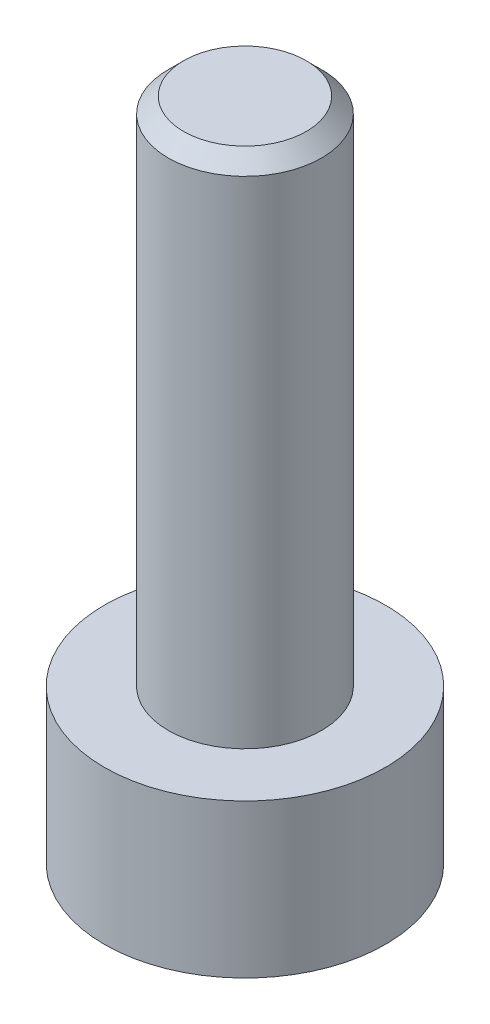
ISO-10303-21;
HEADER;
FILE_DESCRIPTION(('STEP AP214'),'2;1');
FILE_NAME('part.step','',(''),(''),'','','');
FILE_SCHEMA(('AUTOMOTIVE_DESIGN { 1 0 10303 214 1 1 1 1 }'));
ENDSEC;
DATA;
#1=APPLICATION_CONTEXT('core data for automotive mechanical design processes');
#2=APPLICATION_PROTOCOL_DEFINITION('international standard','automotive_design',2000,#1);
#3=PRODUCT_CONTEXT('',#1,'mechanical');
#4=PRODUCT('Part','Part','',(#3));
#5=PRODUCT_RELATED_PRODUCT_CATEGORY('part','',(#4));
#6=PRODUCT_DEFINITION_FORMATION('','',#4);
#7=PRODUCT_DEFINITION_CONTEXT('part definition',#1,'design');
#8=PRODUCT_DEFINITION('design','',#6,#7);
#9=PRODUCT_DEFINITION_SHAPE('','',#8);
#10=(LENGTH_UNIT() NAMED_UNIT(*) SI_UNIT(.MILLI.,.METRE.));
#11=(NAMED_UNIT(*) PLANE_ANGLE_UNIT() SI_UNIT($,.RADIAN.));
#12=(NAMED_UNIT(*) SI_UNIT($,.STERADIAN.) SOLID_ANGLE_UNIT());
#13=UNCERTAINTY_MEASURE_WITH_UNIT(LENGTH_MEASURE(1.E-05),#10,'distance_accuracy_value','');
#14=(GEOMETRIC_REPRESENTATION_CONTEXT(3) GLOBAL_UNCERTAINTY_ASSIGNED_CONTEXT((#13)) GLOBAL_UNIT_ASSIGNED_CONTEXT((#10,
#11,#12)) REPRESENTATION_CONTEXT('',''));
#15=CARTESIAN_POINT('',(0.,0.,0.));
#16=DIRECTION('',(0.,0.,1.));
#17=DIRECTION('',(1.,0.,0.));
#18=AXIS2_PLACEMENT_3D('',#15,#16,#17);
#19=CARTESIAN_POINT('',(0.,3.,0.));
#20=DIRECTION('',(0.,1.,0.));
#21=DIRECTION('',(0.,0.,1.));
#22=AXIS2_PLACEMENT_3D('',#19,#20,#21);
#23=PLANE('',#22);
#24=CARTESIAN_POINT('',(0.,3.,0.));
#25=DIRECTION('',(0.,1.,0.));
#26=DIRECTION('',(0.,0.,1.));
#27=AXIS2_PLACEMENT_3D('',#24,#25,#26);
#28=CIRCLE('',#27,2.75);
#29=CARTESIAN_POINT('',(0.,3.,2.75));
#30=VERTEX_POINT('',#29);
#31=EDGE_CURVE('E146',#30,#30,#28,.T.);
#32=ORIENTED_EDGE('',*,*,#31,.T.);
#33=EDGE_LOOP('',(#32));
#34=FACE_BOUND('',#33,.T.);
#35=CARTESIAN_POINT('',(0.,3.,0.));
#36=DIRECTION('',(0.,1.,0.));
#37=DIRECTION('',(0.,0.,1.));
#38=AXIS2_PLACEMENT_3D('',#35,#36,#37);
#39=CIRCLE('',#38,1.5);
#40=CARTESIAN_POINT('',(0.,3.,1.5));
#41=VERTEX_POINT('',#40);
#42=EDGE_CURVE('E127',#41,#41,#39,.T.);
#43=ORIENTED_EDGE('',*,*,#42,.F.);
#44=EDGE_LOOP('',(#43));
#45=FACE_BOUND('',#44,.T.);
#46=ADVANCED_FACE('F37',(#34,#45),#23,.T.);
#47=CARTESIAN_POINT('',(0.,3.,0.));
#48=DIRECTION('',(0.,-1.,0.));
#49=DIRECTION('',(0.,0.,-1.));
#50=AXIS2_PLACEMENT_3D('',#47,#48,#49);
#51=CYLINDRICAL_SURFACE('',#50,2.75);
#52=ORIENTED_EDGE('',*,*,#31,.F.);
#53=EDGE_LOOP('',(#52));
#54=FACE_BOUND('',#53,.T.);
#55=CARTESIAN_POINT('',(0.,0.,0.));
#56=DIRECTION('',(0.,1.,0.));
#57=DIRECTION('',(0.,0.,1.));
#58=AXIS2_PLACEMENT_3D('',#55,#56,#57);
#59=CIRCLE('',#58,2.75);
#60=CARTESIAN_POINT('',(0.,0.,2.75));
#61=VERTEX_POINT('',#60);
#62=EDGE_CURVE('E140',#61,#61,#59,.T.);
#63=ORIENTED_EDGE('',*,*,#62,.T.);
#64=EDGE_LOOP('',(#63));
#65=FACE_BOUND('',#64,.T.);
#66=ADVANCED_FACE('F164',(#54,#65),#51,.T.);
#67=CARTESIAN_POINT('',(0.,0.,0.));
#68=DIRECTION('',(0.,1.,0.));
#69=DIRECTION('',(0.,0.,1.));
#70=AXIS2_PLACEMENT_3D('',#67,#68,#69);
#71=PLANE('',#70);
#72=DIRECTION('',(-0.866025403784438,0.,-0.5));
#73=VECTOR('',#72,1.);
#74=CARTESIAN_POINT('',(0.,0.,1.25));
#75=LINE('',#74,#73);
#76=CARTESIAN_POINT('',(0.,0.,1.25));
#77=VERTEX_POINT('',#76);
#78=CARTESIAN_POINT('',(-1.08253175473055,0.,0.625));
#79=VERTEX_POINT('',#78);
#80=EDGE_CURVE('E126',#77,#79,#75,.T.);
#81=ORIENTED_EDGE('',*,*,#80,.F.);
#82=DIRECTION('',(-0.866025403784439,0.,0.5));
#83=VECTOR('',#82,1.);
#84=CARTESIAN_POINT('',(1.08253175473055,0.,0.625));
#85=LINE('',#84,#83);
#86=CARTESIAN_POINT('',(1.08253175473055,0.,0.625));
#87=VERTEX_POINT('',#86);
#88=EDGE_CURVE('E52',#87,#77,#85,.T.);
#89=ORIENTED_EDGE('',*,*,#88,.F.);
#90=DIRECTION('',(0.,0.,1.));
#91=VECTOR('',#90,1.);
#92=CARTESIAN_POINT('',(1.08253175473055,0.,-0.625));
#93=LINE('',#92,#91);
#94=CARTESIAN_POINT('',(1.08253175473055,0.,-0.625));
#95=VERTEX_POINT('',#94);
#96=EDGE_CURVE('E136',#95,#87,#93,.T.);
#97=ORIENTED_EDGE('',*,*,#96,.F.);
#98=DIRECTION('',(0.866025403784439,0.,0.5));
#99=VECTOR('',#98,1.);
#100=CARTESIAN_POINT('',(0.,0.,-1.25));
#101=LINE('',#100,#99);
#102=CARTESIAN_POINT('',(0.,0.,-1.25));
#103=VERTEX_POINT('',#102);
#104=EDGE_CURVE('E134',#103,#95,#101,.T.);
#105=ORIENTED_EDGE('',*,*,#104,.F.);
#106=DIRECTION('',(0.866025403784439,0.,-0.5));
#107=VECTOR('',#106,1.);
#108=CARTESIAN_POINT('',(-1.08253175473055,0.,-0.625));
#109=LINE('',#108,#107);
#110=CARTESIAN_POINT('',(-1.08253175473055,0.,-0.625));
#111=VERTEX_POINT('',#110);
#112=EDGE_CURVE('E100',#111,#103,#109,.T.);
#113=ORIENTED_EDGE('',*,*,#112,.F.);
#114=DIRECTION('',(0.,0.,-1.));
#115=VECTOR('',#114,1.);
#116=CARTESIAN_POINT('',(-1.08253175473055,0.,0.625));
#117=LINE('',#116,#115);
#118=EDGE_CURVE('E130',#79,#111,#117,.T.);
#119=ORIENTED_EDGE('',*,*,#118,.F.);
#120=EDGE_LOOP('',(#81,#89,#97,#105,#113,#119));
#121=FACE_BOUND('',#120,.T.);
#122=ORIENTED_EDGE('',*,*,#62,.F.);
#123=EDGE_LOOP('',(#122));
#124=FACE_BOUND('',#123,.T.);
#125=ADVANCED_FACE('F170',(#121,#124),#71,.F.);
#126=CARTESIAN_POINT('',(1.08253175473055,1.5,0.625));
#127=DIRECTION('',(0.5,0.,0.866025403784439));
#128=DIRECTION('',(0.866025403784439,0.,-0.5));
#129=AXIS2_PLACEMENT_3D('',#126,#127,#128);
#130=PLANE('',#129);
#131=ORIENTED_EDGE('',*,*,#88,.T.);
#132=DIRECTION('',(0.,-1.,0.));
#133=VECTOR('',#132,1.);
#134=CARTESIAN_POINT('',(0.,1.5,1.25));
#135=LINE('',#134,#133);
#136=CARTESIAN_POINT('',(0.,1.5,1.25));
#137=VERTEX_POINT('',#136);
#138=EDGE_CURVE('E82',#137,#77,#135,.T.);
#139=ORIENTED_EDGE('',*,*,#138,.F.);
#140=DIRECTION('',(-0.866025403784439,0.,0.5));
#141=VECTOR('',#140,1.);
#142=CARTESIAN_POINT('',(1.08253175473055,1.5,0.625));
#143=LINE('',#142,#141);
#144=CARTESIAN_POINT('',(1.08253175473055,1.5,0.625));
#145=VERTEX_POINT('',#144);
#146=EDGE_CURVE('E138',#145,#137,#143,.T.);
#147=ORIENTED_EDGE('',*,*,#146,.F.);
#148=DIRECTION('',(0.,-1.,0.));
#149=VECTOR('',#148,1.);
#150=CARTESIAN_POINT('',(1.08253175473055,1.5,0.625));
#151=LINE('',#150,#149);
#152=EDGE_CURVE('E60',#145,#87,#151,.T.);
#153=ORIENTED_EDGE('',*,*,#152,.T.);
#154=EDGE_LOOP('',(#131,#139,#147,#153));
#155=FACE_BOUND('',#154,.T.);
#156=ADVANCED_FACE('F175',(#155),#130,.F.);
#157=CARTESIAN_POINT('',(1.08253175473055,1.5,-0.625));
#158=DIRECTION('',(1.,0.,0.));
#159=DIRECTION('',(0.,0.,-1.));
#160=AXIS2_PLACEMENT_3D('',#157,#158,#159);
#161=PLANE('',#160);
#162=ORIENTED_EDGE('',*,*,#96,.T.);
#163=ORIENTED_EDGE('',*,*,#152,.F.);
#164=DIRECTION('',(0.,0.,1.));
#165=VECTOR('',#164,1.);
#166=CARTESIAN_POINT('',(1.08253175473055,1.5,-0.625));
#167=LINE('',#166,#165);
#168=CARTESIAN_POINT('',(1.08253175473055,1.5,-0.625));
#169=VERTEX_POINT('',#168);
#170=EDGE_CURVE('E112',#169,#145,#167,.T.);
#171=ORIENTED_EDGE('',*,*,#170,.F.);
#172=DIRECTION('',(0.,-1.,0.));
#173=VECTOR('',#172,1.);
#174=CARTESIAN_POINT('',(1.08253175473055,1.5,-0.625));
#175=LINE('',#174,#173);
#176=EDGE_CURVE('E104',#169,#95,#175,.T.);
#177=ORIENTED_EDGE('',*,*,#176,.T.);
#178=EDGE_LOOP('',(#162,#163,#171,#177));
#179=FACE_BOUND('',#178,.T.);
#180=ADVANCED_FACE('F182',(#179),#161,.F.);
#181=CARTESIAN_POINT('',(0.,1.5,-1.25));
#182=DIRECTION('',(0.5,0.,-0.866025403784438));
#183=DIRECTION('',(-0.866025403784439,0.,-0.5));
#184=AXIS2_PLACEMENT_3D('',#181,#182,#183);
#185=PLANE('',#184);
#186=ORIENTED_EDGE('',*,*,#104,.T.);
#187=ORIENTED_EDGE('',*,*,#176,.F.);
#188=DIRECTION('',(0.866025403784439,0.,0.5));
#189=VECTOR('',#188,1.);
#190=CARTESIAN_POINT('',(0.,1.5,-1.25));
#191=LINE('',#190,#189);
#192=CARTESIAN_POINT('',(0.,1.5,-1.25));
#193=VERTEX_POINT('',#192);
#194=EDGE_CURVE('E108',#193,#169,#191,.T.);
#195=ORIENTED_EDGE('',*,*,#194,.F.);
#196=DIRECTION('',(0.,-1.,0.));
#197=VECTOR('',#196,1.);
#198=CARTESIAN_POINT('',(0.,1.5,-1.25));
#199=LINE('',#198,#197);
#200=EDGE_CURVE('E93',#193,#103,#199,.T.);
#201=ORIENTED_EDGE('',*,*,#200,.T.);
#202=EDGE_LOOP('',(#186,#187,#195,#201));
#203=FACE_BOUND('',#202,.T.);
#204=ADVANCED_FACE('F109',(#203),#185,.F.);
#205=CARTESIAN_POINT('',(-1.08253175473055,1.5,-0.625));
#206=DIRECTION('',(-0.5,0.,-0.866025403784438));
#207=DIRECTION('',(-0.866025403784439,0.,0.5));
#208=AXIS2_PLACEMENT_3D('',#205,#206,#207);
#209=PLANE('',#208);
#210=ORIENTED_EDGE('',*,*,#112,.T.);
#211=ORIENTED_EDGE('',*,*,#200,.F.);
#212=DIRECTION('',(0.866025403784439,0.,-0.5));
#213=VECTOR('',#212,1.);
#214=CARTESIAN_POINT('',(-1.08253175473055,1.5,-0.625));
#215=LINE('',#214,#213);
#216=CARTESIAN_POINT('',(-1.08253175473055,1.5,-0.625));
#217=VERTEX_POINT('',#216);
#218=EDGE_CURVE('E97',#217,#193,#215,.T.);
#219=ORIENTED_EDGE('',*,*,#218,.F.);
#220=DIRECTION('',(0.,-1.,0.));
#221=VECTOR('',#220,1.);
#222=CARTESIAN_POINT('',(-1.08253175473055,1.5,-0.625));
#223=LINE('',#222,#221);
#224=EDGE_CURVE('E105',#217,#111,#223,.T.);
#225=ORIENTED_EDGE('',*,*,#224,.T.);
#226=EDGE_LOOP('',(#210,#211,#219,#225));
#227=FACE_BOUND('',#226,.T.);
#228=ADVANCED_FACE('F95',(#227),#209,.F.);
#229=CARTESIAN_POINT('',(-1.08253175473055,1.5,0.625));
#230=DIRECTION('',(-1.,0.,0.));
#231=DIRECTION('',(0.,0.,1.));
#232=AXIS2_PLACEMENT_3D('',#229,#230,#231);
#233=PLANE('',#232);
#234=ORIENTED_EDGE('',*,*,#118,.T.);
#235=ORIENTED_EDGE('',*,*,#224,.F.);
#236=DIRECTION('',(0.,0.,-1.));
#237=VECTOR('',#236,1.);
#238=CARTESIAN_POINT('',(-1.08253175473055,1.5,0.625));
#239=LINE('',#238,#237);
#240=CARTESIAN_POINT('',(-1.08253175473055,1.5,0.625));
#241=VERTEX_POINT('',#240);
#242=EDGE_CURVE('E118',#241,#217,#239,.T.);
#243=ORIENTED_EDGE('',*,*,#242,.F.);
#244=DIRECTION('',(0.,-1.,0.));
#245=VECTOR('',#244,1.);
#246=CARTESIAN_POINT('',(-1.08253175473055,1.5,0.625));
#247=LINE('',#246,#245);
#248=EDGE_CURVE('E143',#241,#79,#247,.T.);
#249=ORIENTED_EDGE('',*,*,#248,.T.);
#250=EDGE_LOOP('',(#234,#235,#243,#249));
#251=FACE_BOUND('',#250,.T.);
#252=ADVANCED_FACE('F210',(#251),#233,.F.);
#253=CARTESIAN_POINT('',(0.,1.5,1.25));
#254=DIRECTION('',(-0.5,0.,0.866025403784439));
#255=DIRECTION('',(0.866025403784439,0.,0.5));
#256=AXIS2_PLACEMENT_3D('',#253,#254,#255);
#257=PLANE('',#256);
#258=ORIENTED_EDGE('',*,*,#80,.T.);
#259=ORIENTED_EDGE('',*,*,#248,.F.);
#260=DIRECTION('',(-0.866025403784438,0.,-0.5));
#261=VECTOR('',#260,1.);
#262=CARTESIAN_POINT('',(0.,1.5,1.25));
#263=LINE('',#262,#261);
#264=EDGE_CURVE('E120',#137,#241,#263,.T.);
#265=ORIENTED_EDGE('',*,*,#264,.F.);
#266=ORIENTED_EDGE('',*,*,#138,.T.);
#267=EDGE_LOOP('',(#258,#259,#265,#266));
#268=FACE_BOUND('',#267,.T.);
#269=ADVANCED_FACE('F190',(#268),#257,.F.);
#270=CARTESIAN_POINT('',(0.,1.5,0.));
#271=DIRECTION('',(0.,-1.,0.));
#272=DIRECTION('',(0.,0.,-1.));
#273=AXIS2_PLACEMENT_3D('',#270,#271,#272);
#274=PLANE('',#273);
#275=ORIENTED_EDGE('',*,*,#146,.T.);
#276=ORIENTED_EDGE('',*,*,#264,.T.);
#277=ORIENTED_EDGE('',*,*,#242,.T.);
#278=ORIENTED_EDGE('',*,*,#218,.T.);
#279=ORIENTED_EDGE('',*,*,#194,.T.);
#280=ORIENTED_EDGE('',*,*,#170,.T.);
#281=EDGE_LOOP('',(#275,#276,#277,#278,#279,#280));
#282=FACE_BOUND('',#281,.T.);
#283=ADVANCED_FACE('F115',(#282),#274,.T.);
#284=CARTESIAN_POINT('',(0.,13.,0.));
#285=DIRECTION('',(0.,-1.,0.));
#286=DIRECTION('',(0.,0.,-1.));
#287=AXIS2_PLACEMENT_3D('',#284,#285,#286);
#288=CYLINDRICAL_SURFACE('',#287,1.5);
#289=CARTESIAN_POINT('',(0.,12.7,0.));
#290=DIRECTION('',(0.,1.,0.));
#291=DIRECTION('',(0.,0.,1.));
#292=AXIS2_PLACEMENT_3D('',#289,#290,#291);
#293=CIRCLE('',#292,1.5);
#294=CARTESIAN_POINT('',(0.,12.7,1.5));
#295=VERTEX_POINT('',#294);
#296=EDGE_CURVE('E11',#295,#295,#293,.F.);
#297=ORIENTED_EDGE('',*,*,#296,.T.);
#298=EDGE_LOOP('',(#297));
#299=FACE_BOUND('',#298,.T.);
#300=ORIENTED_EDGE('',*,*,#42,.T.);
#301=EDGE_LOOP('',(#300));
#302=FACE_BOUND('',#301,.T.);
#303=ADVANCED_FACE('F160',(#299,#302),#288,.T.);
#304=CARTESIAN_POINT('',(0.,13.,0.));
#305=DIRECTION('',(0.,1.,0.));
#306=DIRECTION('',(0.,0.,1.));
#307=AXIS2_PLACEMENT_3D('',#304,#305,#306);
#308=PLANE('',#307);
#309=CARTESIAN_POINT('',(0.,13.,0.));
#310=DIRECTION('',(0.,1.,0.));
#311=DIRECTION('',(0.,0.,1.));
#312=AXIS2_PLACEMENT_3D('',#309,#310,#311);
#313=CIRCLE('',#312,1.2);
#314=CARTESIAN_POINT('',(0.,13.,1.2));
#315=VERTEX_POINT('',#314);
#316=EDGE_CURVE('E45',#315,#315,#313,.T.);
#317=ORIENTED_EDGE('',*,*,#316,.T.);
#318=EDGE_LOOP('',(#317));
#319=FACE_BOUND('',#318,.T.);
#320=ADVANCED_FACE('F153',(#319),#308,.T.);
#321=CARTESIAN_POINT('',(0.,13.,0.));
#322=DIRECTION('',(0.,-1.,0.));
#323=DIRECTION('',(0.,0.,-1.));
#324=AXIS2_PLACEMENT_3D('',#321,#322,#323);
#325=CONICAL_SURFACE('',#324,1.2,0.785398163397447);
#326=ORIENTED_EDGE('',*,*,#296,.F.);
#327=EDGE_LOOP('',(#326));
#328=FACE_BOUND('',#327,.T.);
#329=ORIENTED_EDGE('',*,*,#316,.F.);
#330=EDGE_LOOP('',(#329));
#331=FACE_BOUND('',#330,.T.);
#332=ADVANCED_FACE('F39',(#328,#331),#325,.T.);
#333=CLOSED_SHELL('',(#46,#66,#125,#156,#180,#204,#228,#252,#269,#283,#303,#320,#332));
#334=MANIFOLD_SOLID_BREP('B2',#333);
#335=ADVANCED_BREP_SHAPE_REPRESENTATION('',(#18,#334),#14);
#336=SHAPE_DEFINITION_REPRESENTATION(#9,#335);
ENDSEC;
END-ISO-10303-21;
